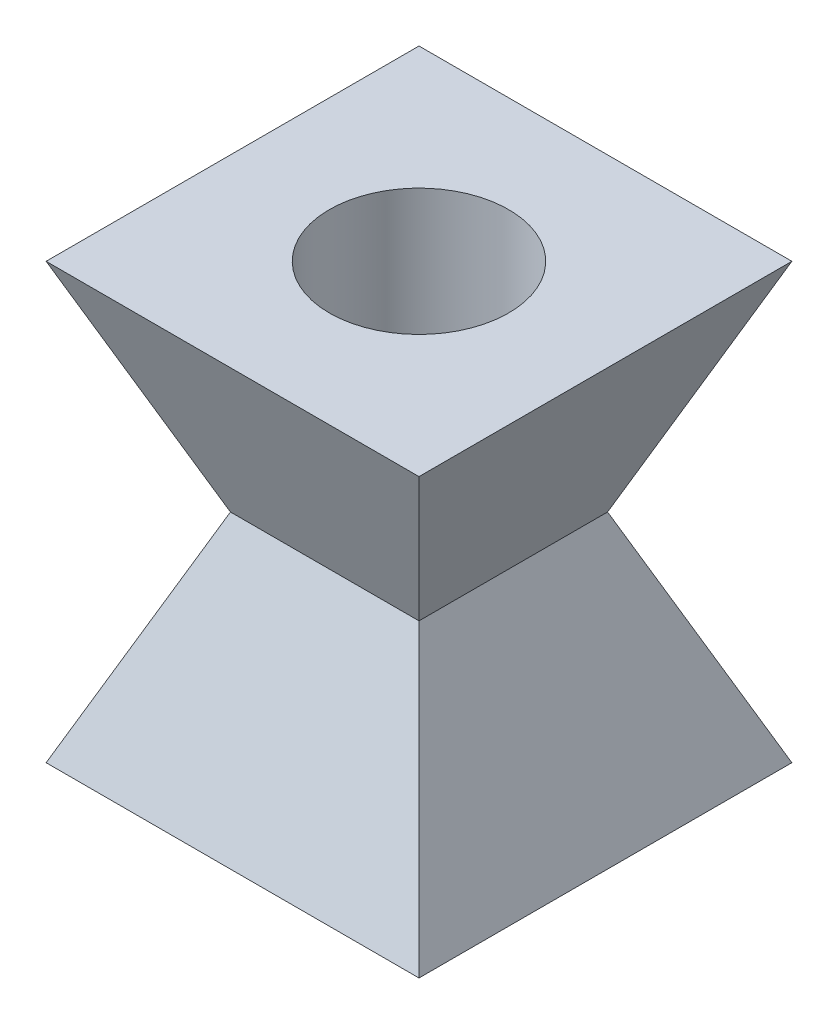
ISO-10303-21;
HEADER;
FILE_DESCRIPTION(('STEP AP214'),'2;1');
FILE_NAME('part.step','',(''),(''),'','','');
FILE_SCHEMA(('AUTOMOTIVE_DESIGN { 1 0 10303 214 1 1 1 1 }'));
ENDSEC;
DATA;
#1=APPLICATION_CONTEXT('core data for automotive mechanical design processes');
#2=APPLICATION_PROTOCOL_DEFINITION('international standard','automotive_design',2000,#1);
#3=PRODUCT_CONTEXT('',#1,'mechanical');
#4=PRODUCT('Part','Part','',(#3));
#5=PRODUCT_RELATED_PRODUCT_CATEGORY('part','',(#4));
#6=PRODUCT_DEFINITION_FORMATION('','',#4);
#7=PRODUCT_DEFINITION_CONTEXT('part definition',#1,'design');
#8=PRODUCT_DEFINITION('design','',#6,#7);
#9=PRODUCT_DEFINITION_SHAPE('','',#8);
#10=(LENGTH_UNIT() NAMED_UNIT(*) SI_UNIT(.MILLI.,.METRE.));
#11=(NAMED_UNIT(*) PLANE_ANGLE_UNIT() SI_UNIT($,.RADIAN.));
#12=(NAMED_UNIT(*) SI_UNIT($,.STERADIAN.) SOLID_ANGLE_UNIT());
#13=UNCERTAINTY_MEASURE_WITH_UNIT(LENGTH_MEASURE(1.E-05),#10,'distance_accuracy_value','');
#14=(GEOMETRIC_REPRESENTATION_CONTEXT(3) GLOBAL_UNCERTAINTY_ASSIGNED_CONTEXT((#13)) GLOBAL_UNIT_ASSIGNED_CONTEXT((#10,
#11,#12)) REPRESENTATION_CONTEXT('',''));
#15=CARTESIAN_POINT('',(0.,0.,0.));
#16=DIRECTION('',(0.,0.,1.));
#17=DIRECTION('',(1.,0.,0.));
#18=AXIS2_PLACEMENT_3D('',#15,#16,#17);
#19=CARTESIAN_POINT('',(25.7045077785942,60.5560254625373,104.));
#20=DIRECTION('',(0.920504853452443,-0.390731128489268,0.));
#21=DIRECTION('',(0.390731128489268,0.920504853452443,0.));
#22=AXIS2_PLACEMENT_3D('',#19,#20,#21);
#23=PLANE('',#22);
#24=DIRECTION('',(0.363936289648098,0.857380168976605,0.363936289648098));
#25=VECTOR('',#24,1.);
#26=CARTESIAN_POINT('',(36.0747161998763,84.9867055059006,36.0747161998763));
#27=LINE('',#26,#25);
#28=CARTESIAN_POINT('',(0.,0.,0.));
#29=VERTEX_POINT('',#28);
#30=CARTESIAN_POINT('',(25.7045077785942,60.5560254625373,25.7045077785942));
#31=VERTEX_POINT('',#30);
#32=EDGE_CURVE('E112',#29,#31,#27,.T.);
#33=ORIENTED_EDGE('',*,*,#32,.F.);
#34=DIRECTION('',(0.,0.,-1.));
#35=VECTOR('',#34,1.);
#36=CARTESIAN_POINT('',(0.,0.,104.));
#37=LINE('',#36,#35);
#38=CARTESIAN_POINT('',(0.,0.,104.));
#39=VERTEX_POINT('',#38);
#40=EDGE_CURVE('E119',#39,#29,#37,.T.);
#41=ORIENTED_EDGE('',*,*,#40,.F.);
#42=DIRECTION('',(-0.363936289648098,-0.857380168976605,0.363936289648098));
#43=VECTOR('',#42,1.);
#44=CARTESIAN_POINT('',(22.2999554159026,52.5354027243193,81.7000445840974));
#45=LINE('',#44,#43);
#46=CARTESIAN_POINT('',(25.7045077785942,60.5560254625373,78.2954922214058));
#47=VERTEX_POINT('',#46);
#48=EDGE_CURVE('E135',#47,#39,#45,.T.);
#49=ORIENTED_EDGE('',*,*,#48,.F.);
#50=DIRECTION('',(0.,0.,-1.));
#51=VECTOR('',#50,1.);
#52=CARTESIAN_POINT('',(25.7045077785942,60.5560254625373,104.));
#53=LINE('',#52,#51);
#54=EDGE_CURVE('E138',#47,#31,#53,.T.);
#55=ORIENTED_EDGE('',*,*,#54,.T.);
#56=EDGE_LOOP('',(#33,#41,#49,#55));
#57=FACE_BOUND('',#56,.T.);
#58=ADVANCED_FACE('F38',(#57),#23,.F.);
#59=CARTESIAN_POINT('',(0.,121.112050925075,104.));
#60=DIRECTION('',(0.920504853452443,0.390731128489268,0.));
#61=DIRECTION('',(-0.390731128489268,0.920504853452443,0.));
#62=AXIS2_PLACEMENT_3D('',#59,#60,#61);
#63=PLANE('',#62);
#64=DIRECTION('',(-0.363936289648098,0.857380168976605,-0.363936289648098));
#65=VECTOR('',#64,1.);
#66=CARTESIAN_POINT('',(13.7747607839737,88.6607481434933,13.7747607839737));
#67=LINE('',#66,#65);
#68=CARTESIAN_POINT('',(0.,121.112050925075,0.));
#69=VERTEX_POINT('',#68);
#70=EDGE_CURVE('E96',#31,#69,#67,.T.);
#71=ORIENTED_EDGE('',*,*,#70,.F.);
#72=ORIENTED_EDGE('',*,*,#54,.F.);
#73=DIRECTION('',(0.363936289648098,-0.857380168976605,-0.363936289648098));
#74=VECTOR('',#73,1.);
#75=CARTESIAN_POINT('',(0.,121.112050925075,104.));
#76=LINE('',#75,#74);
#77=CARTESIAN_POINT('',(0.,121.112050925075,104.));
#78=VERTEX_POINT('',#77);
#79=EDGE_CURVE('E134',#78,#47,#76,.T.);
#80=ORIENTED_EDGE('',*,*,#79,.F.);
#81=DIRECTION('',(0.,0.,-1.));
#82=VECTOR('',#81,1.);
#83=CARTESIAN_POINT('',(0.,121.112050925075,104.));
#84=LINE('',#83,#82);
#85=EDGE_CURVE('E117',#78,#69,#84,.T.);
#86=ORIENTED_EDGE('',*,*,#85,.T.);
#87=EDGE_LOOP('',(#71,#72,#80,#86));
#88=FACE_BOUND('',#87,.T.);
#89=ADVANCED_FACE('F160',(#88),#63,.F.);
#90=CARTESIAN_POINT('',(104.,121.112050925075,104.));
#91=DIRECTION('',(-0.920504853452443,0.390731128489268,0.));
#92=DIRECTION('',(-0.390731128489268,-0.920504853452443,0.));
#93=AXIS2_PLACEMENT_3D('',#90,#91,#92);
#94=PLANE('',#93);
#95=DIRECTION('',(-0.363936289648098,-0.857380168976605,0.363936289648098));
#96=VECTOR('',#95,1.);
#97=CARTESIAN_POINT('',(90.2252392160263,88.6607481434933,13.7747607839737));
#98=LINE('',#97,#96);
#99=CARTESIAN_POINT('',(104.,121.112050925075,0.));
#100=VERTEX_POINT('',#99);
#101=CARTESIAN_POINT('',(78.2954922214058,60.5560254625373,25.7045077785942));
#102=VERTEX_POINT('',#101);
#103=EDGE_CURVE('E94',#100,#102,#98,.T.);
#104=ORIENTED_EDGE('',*,*,#103,.F.);
#105=DIRECTION('',(0.,0.,-1.));
#106=VECTOR('',#105,1.);
#107=CARTESIAN_POINT('',(104.,121.112050925075,104.));
#108=LINE('',#107,#106);
#109=CARTESIAN_POINT('',(104.,121.112050925075,104.));
#110=VERTEX_POINT('',#109);
#111=EDGE_CURVE('E108',#110,#100,#108,.T.);
#112=ORIENTED_EDGE('',*,*,#111,.F.);
#113=DIRECTION('',(0.363936289648098,0.857380168976605,0.363936289648098));
#114=VECTOR('',#113,1.);
#115=CARTESIAN_POINT('',(104.,121.112050925075,104.));
#116=LINE('',#115,#114);
#117=CARTESIAN_POINT('',(78.2954922214058,60.5560254625373,78.2954922214058));
#118=VERTEX_POINT('',#117);
#119=EDGE_CURVE('E11',#118,#110,#116,.T.);
#120=ORIENTED_EDGE('',*,*,#119,.F.);
#121=DIRECTION('',(0.,0.,-1.));
#122=VECTOR('',#121,1.);
#123=CARTESIAN_POINT('',(78.2954922214058,60.5560254625373,104.));
#124=LINE('',#123,#122);
#125=EDGE_CURVE('E111',#118,#102,#124,.T.);
#126=ORIENTED_EDGE('',*,*,#125,.T.);
#127=EDGE_LOOP('',(#104,#112,#120,#126));
#128=FACE_BOUND('',#127,.T.);
#129=ADVANCED_FACE('F106',(#128),#94,.F.);
#130=CARTESIAN_POINT('',(78.2954922214058,60.5560254625373,104.));
#131=DIRECTION('',(-0.920504853452443,-0.390731128489268,0.));
#132=DIRECTION('',(0.390731128489268,-0.920504853452443,0.));
#133=AXIS2_PLACEMENT_3D('',#130,#131,#132);
#134=PLANE('',#133);
#135=DIRECTION('',(0.363936289648098,-0.857380168976605,-0.363936289648098));
#136=VECTOR('',#135,1.);
#137=CARTESIAN_POINT('',(67.9252838001237,84.9867055059006,36.0747161998763));
#138=LINE('',#137,#136);
#139=CARTESIAN_POINT('',(104.,0.,0.));
#140=VERTEX_POINT('',#139);
#141=EDGE_CURVE('E53',#102,#140,#138,.T.);
#142=ORIENTED_EDGE('',*,*,#141,.F.);
#143=ORIENTED_EDGE('',*,*,#125,.F.);
#144=DIRECTION('',(-0.363936289648098,0.857380168976605,-0.363936289648098));
#145=VECTOR('',#144,1.);
#146=CARTESIAN_POINT('',(81.7000445840974,52.5354027243193,81.7000445840974));
#147=LINE('',#146,#145);
#148=CARTESIAN_POINT('',(104.,0.,104.));
#149=VERTEX_POINT('',#148);
#150=EDGE_CURVE('E46',#149,#118,#147,.T.);
#151=ORIENTED_EDGE('',*,*,#150,.F.);
#152=DIRECTION('',(0.,0.,-1.));
#153=VECTOR('',#152,1.);
#154=CARTESIAN_POINT('',(104.,0.,104.));
#155=LINE('',#154,#153);
#156=EDGE_CURVE('E116',#149,#140,#155,.T.);
#157=ORIENTED_EDGE('',*,*,#156,.T.);
#158=EDGE_LOOP('',(#142,#143,#151,#157));
#159=FACE_BOUND('',#158,.T.);
#160=ADVANCED_FACE('F137',(#159),#134,.F.);
#161=CARTESIAN_POINT('',(0.,0.,104.));
#162=DIRECTION('',(0.,1.,0.));
#163=DIRECTION('',(0.,0.,1.));
#164=AXIS2_PLACEMENT_3D('',#161,#162,#163);
#165=PLANE('',#164);
#166=CARTESIAN_POINT('',(52.,0.,52.));
#167=DIRECTION('',(0.,1.,0.));
#168=DIRECTION('',(0.,0.,1.));
#169=AXIS2_PLACEMENT_3D('',#166,#167,#168);
#170=CIRCLE('',#169,25.);
#171=CARTESIAN_POINT('',(52.,0.,77.));
#172=VERTEX_POINT('',#171);
#173=EDGE_CURVE('E183',#172,#172,#170,.T.);
#174=ORIENTED_EDGE('',*,*,#173,.T.);
#175=EDGE_LOOP('',(#174));
#176=FACE_BOUND('',#175,.T.);
#177=DIRECTION('',(1.,0.,0.));
#178=VECTOR('',#177,1.);
#179=CARTESIAN_POINT('',(0.,0.,0.));
#180=LINE('',#179,#178);
#181=EDGE_CURVE('E101',#29,#140,#180,.T.);
#182=ORIENTED_EDGE('',*,*,#181,.T.);
#183=ORIENTED_EDGE('',*,*,#156,.F.);
#184=DIRECTION('',(1.,0.,0.));
#185=VECTOR('',#184,1.);
#186=CARTESIAN_POINT('',(0.,0.,104.));
#187=LINE('',#186,#185);
#188=EDGE_CURVE('E61',#39,#149,#187,.T.);
#189=ORIENTED_EDGE('',*,*,#188,.F.);
#190=ORIENTED_EDGE('',*,*,#40,.T.);
#191=EDGE_LOOP('',(#182,#183,#189,#190));
#192=FACE_BOUND('',#191,.T.);
#193=ADVANCED_FACE('F40',(#176,#192),#165,.F.);
#194=CARTESIAN_POINT('',(0.,121.112050925075,104.));
#195=DIRECTION('',(0.,-1.,0.));
#196=DIRECTION('',(0.,0.,-1.));
#197=AXIS2_PLACEMENT_3D('',#194,#195,#196);
#198=PLANE('',#197);
#199=CARTESIAN_POINT('',(52.,121.112050925075,52.));
#200=DIRECTION('',(0.,1.,0.));
#201=DIRECTION('',(0.,0.,1.));
#202=AXIS2_PLACEMENT_3D('',#199,#200,#201);
#203=CIRCLE('',#202,25.);
#204=CARTESIAN_POINT('',(52.,121.112050925075,77.));
#205=VERTEX_POINT('',#204);
#206=EDGE_CURVE('E181',#205,#205,#203,.T.);
#207=ORIENTED_EDGE('',*,*,#206,.F.);
#208=EDGE_LOOP('',(#207));
#209=FACE_BOUND('',#208,.T.);
#210=DIRECTION('',(-1.,0.,0.));
#211=VECTOR('',#210,1.);
#212=CARTESIAN_POINT('',(0.,121.112050925075,0.));
#213=LINE('',#212,#211);
#214=EDGE_CURVE('E90',#100,#69,#213,.T.);
#215=ORIENTED_EDGE('',*,*,#214,.T.);
#216=ORIENTED_EDGE('',*,*,#85,.F.);
#217=DIRECTION('',(-1.,0.,0.));
#218=VECTOR('',#217,1.);
#219=CARTESIAN_POINT('',(0.,121.112050925075,104.));
#220=LINE('',#219,#218);
#221=EDGE_CURVE('E115',#110,#78,#220,.T.);
#222=ORIENTED_EDGE('',*,*,#221,.F.);
#223=ORIENTED_EDGE('',*,*,#111,.T.);
#224=EDGE_LOOP('',(#215,#216,#222,#223));
#225=FACE_BOUND('',#224,.T.);
#226=ADVANCED_FACE('F114',(#209,#225),#198,.F.);
#227=CARTESIAN_POINT('',(104.,121.112050925075,104.));
#228=DIRECTION('',(0.,-0.390731128489268,0.920504853452442));
#229=DIRECTION('',(0.,-0.920504853452443,-0.390731128489268));
#230=AXIS2_PLACEMENT_3D('',#227,#228,#229);
#231=PLANE('',#230);
#232=ORIENTED_EDGE('',*,*,#79,.T.);
#233=DIRECTION('',(-1.,0.,0.));
#234=VECTOR('',#233,1.);
#235=CARTESIAN_POINT('',(104.,60.5560254625373,78.2954922214058));
#236=LINE('',#235,#234);
#237=EDGE_CURVE('E127',#118,#47,#236,.T.);
#238=ORIENTED_EDGE('',*,*,#237,.F.);
#239=ORIENTED_EDGE('',*,*,#119,.T.);
#240=ORIENTED_EDGE('',*,*,#221,.T.);
#241=EDGE_LOOP('',(#232,#238,#239,#240));
#242=FACE_BOUND('',#241,.T.);
#243=ADVANCED_FACE('F132',(#242),#231,.T.);
#244=CARTESIAN_POINT('',(104.,60.5560254625373,78.2954922214058));
#245=DIRECTION('',(0.,0.390731128489268,0.920504853452442));
#246=DIRECTION('',(0.,-0.920504853452443,0.390731128489268));
#247=AXIS2_PLACEMENT_3D('',#244,#245,#246);
#248=PLANE('',#247);
#249=ORIENTED_EDGE('',*,*,#48,.T.);
#250=ORIENTED_EDGE('',*,*,#188,.T.);
#251=ORIENTED_EDGE('',*,*,#150,.T.);
#252=ORIENTED_EDGE('',*,*,#237,.T.);
#253=EDGE_LOOP('',(#249,#250,#251,#252));
#254=FACE_BOUND('',#253,.T.);
#255=ADVANCED_FACE('F126',(#254),#248,.T.);
#256=CARTESIAN_POINT('',(104.,121.112050925075,0.));
#257=DIRECTION('',(0.,-0.390731128489268,-0.920504853452443));
#258=DIRECTION('',(0.,0.920504853452443,-0.390731128489268));
#259=AXIS2_PLACEMENT_3D('',#256,#257,#258);
#260=PLANE('',#259);
#261=ORIENTED_EDGE('',*,*,#70,.T.);
#262=ORIENTED_EDGE('',*,*,#214,.F.);
#263=ORIENTED_EDGE('',*,*,#103,.T.);
#264=DIRECTION('',(-1.,0.,0.));
#265=VECTOR('',#264,1.);
#266=CARTESIAN_POINT('',(104.,60.5560254625373,25.7045077785942));
#267=LINE('',#266,#265);
#268=EDGE_CURVE('E155',#102,#31,#267,.T.);
#269=ORIENTED_EDGE('',*,*,#268,.T.);
#270=EDGE_LOOP('',(#261,#262,#263,#269));
#271=FACE_BOUND('',#270,.T.);
#272=ADVANCED_FACE('F92',(#271),#260,.T.);
#273=CARTESIAN_POINT('',(104.,60.5560254625373,25.7045077785942));
#274=DIRECTION('',(0.,0.390731128489268,-0.920504853452443));
#275=DIRECTION('',(0.,0.920504853452443,0.390731128489268));
#276=AXIS2_PLACEMENT_3D('',#273,#274,#275);
#277=PLANE('',#276);
#278=ORIENTED_EDGE('',*,*,#32,.T.);
#279=ORIENTED_EDGE('',*,*,#268,.F.);
#280=ORIENTED_EDGE('',*,*,#141,.T.);
#281=ORIENTED_EDGE('',*,*,#181,.F.);
#282=EDGE_LOOP('',(#278,#279,#280,#281));
#283=FACE_BOUND('',#282,.T.);
#284=ADVANCED_FACE('F151',(#283),#277,.T.);
#285=CARTESIAN_POINT('',(52.,0.,52.));
#286=DIRECTION('',(0.,1.,0.));
#287=DIRECTION('',(0.,0.,1.));
#288=AXIS2_PLACEMENT_3D('',#285,#286,#287);
#289=CYLINDRICAL_SURFACE('',#288,25.);
#290=ORIENTED_EDGE('',*,*,#173,.F.);
#291=EDGE_LOOP('',(#290));
#292=FACE_BOUND('',#291,.T.);
#293=ORIENTED_EDGE('',*,*,#206,.T.);
#294=EDGE_LOOP('',(#293));
#295=FACE_BOUND('',#294,.T.);
#296=ADVANCED_FACE('F189',(#292,#295),#289,.F.);
#297=CLOSED_SHELL('',(#58,#89,#129,#160,#193,#226,#243,#255,#272,#284,#296));
#298=MANIFOLD_SOLID_BREP('B2',#297);
#299=ADVANCED_BREP_SHAPE_REPRESENTATION('',(#18,#298),#14);
#300=SHAPE_DEFINITION_REPRESENTATION(#9,#299);
ENDSEC;
END-ISO-10303-21;
